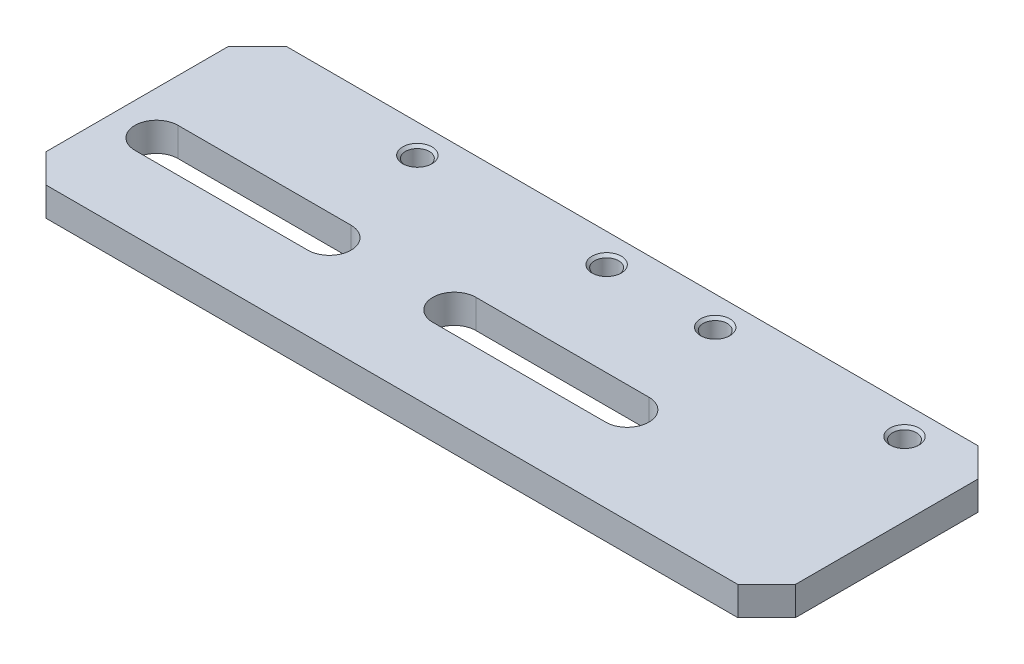
ISO-10303-21;
HEADER;
FILE_DESCRIPTION(('STEP AP214'),'2;1');
FILE_NAME('part.step','',(''),(''),'','','');
FILE_SCHEMA(('AUTOMOTIVE_DESIGN { 1 0 10303 214 1 1 1 1 }'));
ENDSEC;
DATA;
#1=APPLICATION_CONTEXT('core data for automotive mechanical design processes');
#2=APPLICATION_PROTOCOL_DEFINITION('international standard','automotive_design',2000,#1);
#3=PRODUCT_CONTEXT('',#1,'mechanical');
#4=PRODUCT('Part','Part','',(#3));
#5=PRODUCT_RELATED_PRODUCT_CATEGORY('part','',(#4));
#6=PRODUCT_DEFINITION_FORMATION('','',#4);
#7=PRODUCT_DEFINITION_CONTEXT('part definition',#1,'design');
#8=PRODUCT_DEFINITION('design','',#6,#7);
#9=PRODUCT_DEFINITION_SHAPE('','',#8);
#10=(LENGTH_UNIT() NAMED_UNIT(*) SI_UNIT(.MILLI.,.METRE.));
#11=(NAMED_UNIT(*) PLANE_ANGLE_UNIT() SI_UNIT($,.RADIAN.));
#12=(NAMED_UNIT(*) SI_UNIT($,.STERADIAN.) SOLID_ANGLE_UNIT());
#13=UNCERTAINTY_MEASURE_WITH_UNIT(LENGTH_MEASURE(1.E-05),#10,'distance_accuracy_value','');
#14=(GEOMETRIC_REPRESENTATION_CONTEXT(3) GLOBAL_UNCERTAINTY_ASSIGNED_CONTEXT((#13)) GLOBAL_UNIT_ASSIGNED_CONTEXT((#10,
#11,#12)) REPRESENTATION_CONTEXT('',''));
#15=CARTESIAN_POINT('',(0.,0.,0.));
#16=DIRECTION('',(0.,0.,1.));
#17=DIRECTION('',(1.,0.,0.));
#18=AXIS2_PLACEMENT_3D('',#15,#16,#17);
#19=CARTESIAN_POINT('',(30.,3.,-12.5));
#20=DIRECTION('',(-0.707106781186548,0.,0.707106781186547));
#21=DIRECTION('',(0.,1.,0.));
#22=AXIS2_PLACEMENT_3D('',#19,#20,#21);
#23=PLANE('',#22);
#24=DIRECTION('',(-0.707106781186547,0.,-0.707106781186548));
#25=VECTOR('',#24,1.);
#26=CARTESIAN_POINT('',(21.25,3.,-21.25));
#27=LINE('',#26,#25);
#28=CARTESIAN_POINT('',(33.,3.,-9.5));
#29=VERTEX_POINT('',#28);
#30=CARTESIAN_POINT('',(30.,3.,-12.5));
#31=VERTEX_POINT('',#30);
#32=EDGE_CURVE('E345',#29,#31,#27,.T.);
#33=ORIENTED_EDGE('',*,*,#32,.F.);
#34=DIRECTION('',(0.,1.,0.));
#35=VECTOR('',#34,1.);
#36=CARTESIAN_POINT('',(33.,3.,-9.5));
#37=LINE('',#36,#35);
#38=CARTESIAN_POINT('',(33.,0.,-9.5));
#39=VERTEX_POINT('',#38);
#40=EDGE_CURVE('E302',#39,#29,#37,.T.);
#41=ORIENTED_EDGE('',*,*,#40,.F.);
#42=DIRECTION('',(0.707106781186547,0.,0.707106781186548));
#43=VECTOR('',#42,1.);
#44=CARTESIAN_POINT('',(30.,0.,-12.5));
#45=LINE('',#44,#43);
#46=CARTESIAN_POINT('',(30.,0.,-12.5));
#47=VERTEX_POINT('',#46);
#48=EDGE_CURVE('E242',#47,#39,#45,.T.);
#49=ORIENTED_EDGE('',*,*,#48,.F.);
#50=DIRECTION('',(0.,-1.,0.));
#51=VECTOR('',#50,1.);
#52=CARTESIAN_POINT('',(30.,3.,-12.5));
#53=LINE('',#52,#51);
#54=EDGE_CURVE('E334',#31,#47,#53,.T.);
#55=ORIENTED_EDGE('',*,*,#54,.F.);
#56=EDGE_LOOP('',(#33,#41,#49,#55));
#57=FACE_BOUND('',#56,.T.);
#58=ADVANCED_FACE('F17',(#57),#23,.F.);
#59=CARTESIAN_POINT('',(-45.,3.,-9.5));
#60=DIRECTION('',(0.707106781186548,0.,0.707106781186548));
#61=DIRECTION('',(0.,-1.,0.));
#62=AXIS2_PLACEMENT_3D('',#59,#60,#61);
#63=PLANE('',#62);
#64=DIRECTION('',(-0.707106781186548,0.,0.707106781186548));
#65=VECTOR('',#64,1.);
#66=CARTESIAN_POINT('',(-27.25,3.,-27.25));
#67=LINE('',#66,#65);
#68=CARTESIAN_POINT('',(-42.,3.,-12.5));
#69=VERTEX_POINT('',#68);
#70=CARTESIAN_POINT('',(-45.,3.,-9.5));
#71=VERTEX_POINT('',#70);
#72=EDGE_CURVE('E348',#69,#71,#67,.T.);
#73=ORIENTED_EDGE('',*,*,#72,.F.);
#74=DIRECTION('',(0.,1.,0.));
#75=VECTOR('',#74,1.);
#76=CARTESIAN_POINT('',(-42.,3.,-12.5));
#77=LINE('',#76,#75);
#78=CARTESIAN_POINT('',(-42.,0.,-12.5));
#79=VERTEX_POINT('',#78);
#80=EDGE_CURVE('E236',#79,#69,#77,.T.);
#81=ORIENTED_EDGE('',*,*,#80,.F.);
#82=DIRECTION('',(0.707106781186548,0.,-0.707106781186548));
#83=VECTOR('',#82,1.);
#84=CARTESIAN_POINT('',(-45.,0.,-9.5));
#85=LINE('',#84,#83);
#86=CARTESIAN_POINT('',(-45.,0.,-9.5));
#87=VERTEX_POINT('',#86);
#88=EDGE_CURVE('E230',#87,#79,#85,.T.);
#89=ORIENTED_EDGE('',*,*,#88,.F.);
#90=DIRECTION('',(0.,-1.,0.));
#91=VECTOR('',#90,1.);
#92=CARTESIAN_POINT('',(-45.,3.,-9.5));
#93=LINE('',#92,#91);
#94=EDGE_CURVE('E233',#71,#87,#93,.T.);
#95=ORIENTED_EDGE('',*,*,#94,.F.);
#96=EDGE_LOOP('',(#73,#81,#89,#95));
#97=FACE_BOUND('',#96,.T.);
#98=ADVANCED_FACE('F232',(#97),#63,.F.);
#99=CARTESIAN_POINT('',(-42.,3.,12.5));
#100=DIRECTION('',(0.70710678118655,0.,-0.707106781186545));
#101=DIRECTION('',(0.,-1.,0.));
#102=AXIS2_PLACEMENT_3D('',#99,#100,#101);
#103=PLANE('',#102);
#104=DIRECTION('',(0.707106781186545,0.,0.70710678118655));
#105=VECTOR('',#104,1.);
#106=CARTESIAN_POINT('',(-27.25,3.,27.25));
#107=LINE('',#106,#105);
#108=CARTESIAN_POINT('',(-45.,3.,9.5));
#109=VERTEX_POINT('',#108);
#110=CARTESIAN_POINT('',(-42.,3.,12.5));
#111=VERTEX_POINT('',#110);
#112=EDGE_CURVE('E351',#109,#111,#107,.T.);
#113=ORIENTED_EDGE('',*,*,#112,.F.);
#114=DIRECTION('',(0.,1.,0.));
#115=VECTOR('',#114,1.);
#116=CARTESIAN_POINT('',(-45.,3.,9.5));
#117=LINE('',#116,#115);
#118=CARTESIAN_POINT('',(-45.,0.,9.5));
#119=VERTEX_POINT('',#118);
#120=EDGE_CURVE('E260',#119,#109,#117,.T.);
#121=ORIENTED_EDGE('',*,*,#120,.F.);
#122=DIRECTION('',(-0.707106781186545,0.,-0.70710678118655));
#123=VECTOR('',#122,1.);
#124=CARTESIAN_POINT('',(-42.,0.,12.5));
#125=LINE('',#124,#123);
#126=CARTESIAN_POINT('',(-42.,0.,12.5));
#127=VERTEX_POINT('',#126);
#128=EDGE_CURVE('E243',#127,#119,#125,.T.);
#129=ORIENTED_EDGE('',*,*,#128,.F.);
#130=DIRECTION('',(0.,-1.,0.));
#131=VECTOR('',#130,1.);
#132=CARTESIAN_POINT('',(-42.,3.,12.5));
#133=LINE('',#132,#131);
#134=EDGE_CURVE('E272',#111,#127,#133,.T.);
#135=ORIENTED_EDGE('',*,*,#134,.F.);
#136=EDGE_LOOP('',(#113,#121,#129,#135));
#137=FACE_BOUND('',#136,.T.);
#138=ADVANCED_FACE('F790',(#137),#103,.F.);
#139=CARTESIAN_POINT('',(33.,3.,9.5));
#140=DIRECTION('',(-0.707106781186547,0.,-0.707106781186548));
#141=DIRECTION('',(-0.707106781186548,0.,0.707106781186547));
#142=AXIS2_PLACEMENT_3D('',#139,#140,#141);
#143=PLANE('',#142);
#144=DIRECTION('',(0.707106781186548,0.,-0.707106781186547));
#145=VECTOR('',#144,1.);
#146=CARTESIAN_POINT('',(21.25,3.,21.25));
#147=LINE('',#146,#145);
#148=CARTESIAN_POINT('',(30.,3.,12.5));
#149=VERTEX_POINT('',#148);
#150=CARTESIAN_POINT('',(33.,3.,9.5));
#151=VERTEX_POINT('',#150);
#152=EDGE_CURVE('E342',#149,#151,#147,.T.);
#153=ORIENTED_EDGE('',*,*,#152,.F.);
#154=DIRECTION('',(0.,1.,0.));
#155=VECTOR('',#154,1.);
#156=CARTESIAN_POINT('',(30.,3.,12.5));
#157=LINE('',#156,#155);
#158=CARTESIAN_POINT('',(30.,0.,12.5));
#159=VERTEX_POINT('',#158);
#160=EDGE_CURVE('E273',#159,#149,#157,.T.);
#161=ORIENTED_EDGE('',*,*,#160,.F.);
#162=DIRECTION('',(-0.707106781186548,0.,0.707106781186547));
#163=VECTOR('',#162,1.);
#164=CARTESIAN_POINT('',(33.,0.,9.5));
#165=LINE('',#164,#163);
#166=CARTESIAN_POINT('',(33.,0.,9.5));
#167=VERTEX_POINT('',#166);
#168=EDGE_CURVE('E335',#167,#159,#165,.T.);
#169=ORIENTED_EDGE('',*,*,#168,.F.);
#170=DIRECTION('',(0.,-1.,0.));
#171=VECTOR('',#170,1.);
#172=CARTESIAN_POINT('',(33.,3.,9.5));
#173=LINE('',#172,#171);
#174=EDGE_CURVE('E303',#151,#167,#173,.T.);
#175=ORIENTED_EDGE('',*,*,#174,.F.);
#176=EDGE_LOOP('',(#153,#161,#169,#175));
#177=FACE_BOUND('',#176,.T.);
#178=ADVANCED_FACE('F785',(#177),#143,.F.);
#179=CARTESIAN_POINT('',(-25.35,3.,-9.5));
#180=DIRECTION('',(0.,1.,0.));
#181=DIRECTION('',(0.,0.,1.));
#182=AXIS2_PLACEMENT_3D('',#179,#180,#181);
#183=CONICAL_SURFACE('',#182,1.525,0.785398163397445);
#184=CARTESIAN_POINT('',(-25.35,2.725,-9.5));
#185=DIRECTION('',(0.,1.,0.));
#186=DIRECTION('',(0.,0.,1.));
#187=AXIS2_PLACEMENT_3D('',#184,#185,#186);
#188=CIRCLE('',#187,1.24999999999999);
#189=CARTESIAN_POINT('',(-25.35,2.725,-8.25));
#190=VERTEX_POINT('',#189);
#191=EDGE_CURVE('E11',#190,#190,#188,.T.);
#192=ORIENTED_EDGE('',*,*,#191,.F.);
#193=EDGE_LOOP('',(#192));
#194=FACE_BOUND('',#193,.T.);
#195=CARTESIAN_POINT('',(-25.35,3.,-9.5));
#196=DIRECTION('',(0.,1.,0.));
#197=DIRECTION('',(0.,0.,1.));
#198=AXIS2_PLACEMENT_3D('',#195,#196,#197);
#199=CIRCLE('',#198,1.525);
#200=CARTESIAN_POINT('',(-25.35,3.,-7.975));
#201=VERTEX_POINT('',#200);
#202=EDGE_CURVE('E362',#201,#201,#199,.T.);
#203=ORIENTED_EDGE('',*,*,#202,.T.);
#204=EDGE_LOOP('',(#203));
#205=FACE_BOUND('',#204,.T.);
#206=ADVANCED_FACE('F789',(#194,#205),#183,.F.);
#207=CARTESIAN_POINT('',(-25.35,3.,-9.5));
#208=DIRECTION('',(0.,1.,0.));
#209=DIRECTION('',(0.,0.,1.));
#210=AXIS2_PLACEMENT_3D('',#207,#208,#209);
#211=CYLINDRICAL_SURFACE('',#210,1.25);
#212=CARTESIAN_POINT('',(-25.35,0.275,-9.5));
#213=DIRECTION('',(0.,1.,0.));
#214=DIRECTION('',(0.,0.,1.));
#215=AXIS2_PLACEMENT_3D('',#212,#213,#214);
#216=CIRCLE('',#215,1.25);
#217=CARTESIAN_POINT('',(-25.35,0.275,-8.25));
#218=VERTEX_POINT('',#217);
#219=EDGE_CURVE('E25',#218,#218,#216,.T.);
#220=ORIENTED_EDGE('',*,*,#219,.F.);
#221=EDGE_LOOP('',(#220));
#222=FACE_BOUND('',#221,.T.);
#223=ORIENTED_EDGE('',*,*,#191,.T.);
#224=EDGE_LOOP('',(#223));
#225=FACE_BOUND('',#224,.T.);
#226=ADVANCED_FACE('F1003',(#222,#225),#211,.F.);
#227=CARTESIAN_POINT('',(-25.35,0.275,-9.5));
#228=DIRECTION('',(0.,-1.,0.));
#229=DIRECTION('',(0.,0.,-1.));
#230=AXIS2_PLACEMENT_3D('',#227,#228,#229);
#231=CONICAL_SURFACE('',#230,1.25,0.78539816339745);
#232=ORIENTED_EDGE('',*,*,#219,.T.);
#233=EDGE_LOOP('',(#232));
#234=FACE_BOUND('',#233,.T.);
#235=CARTESIAN_POINT('',(-25.35,0.,-9.5));
#236=DIRECTION('',(0.,1.,0.));
#237=DIRECTION('',(0.,0.,1.));
#238=AXIS2_PLACEMENT_3D('',#235,#236,#237);
#239=CIRCLE('',#238,1.525);
#240=CARTESIAN_POINT('',(-25.35,0.,-7.975));
#241=VERTEX_POINT('',#240);
#242=EDGE_CURVE('E424',#241,#241,#239,.T.);
#243=ORIENTED_EDGE('',*,*,#242,.F.);
#244=EDGE_LOOP('',(#243));
#245=FACE_BOUND('',#244,.T.);
#246=ADVANCED_FACE('F994',(#234,#245),#231,.F.);
#247=CARTESIAN_POINT('',(-5.65,3.,-9.5));
#248=DIRECTION('',(0.,1.,0.));
#249=DIRECTION('',(0.,0.,1.));
#250=AXIS2_PLACEMENT_3D('',#247,#248,#249);
#251=CONICAL_SURFACE('',#250,1.525,0.785398163397448);
#252=CARTESIAN_POINT('',(-5.65,2.725,-9.5));
#253=DIRECTION('',(0.,1.,0.));
#254=DIRECTION('',(0.,0.,1.));
#255=AXIS2_PLACEMENT_3D('',#252,#253,#254);
#256=CIRCLE('',#255,1.24999999999999);
#257=CARTESIAN_POINT('',(-5.65,2.725,-8.25));
#258=VERTEX_POINT('',#257);
#259=EDGE_CURVE('E304',#258,#258,#256,.T.);
#260=ORIENTED_EDGE('',*,*,#259,.F.);
#261=EDGE_LOOP('',(#260));
#262=FACE_BOUND('',#261,.T.);
#263=CARTESIAN_POINT('',(-5.65,3.,-9.5));
#264=DIRECTION('',(0.,1.,0.));
#265=DIRECTION('',(0.,0.,1.));
#266=AXIS2_PLACEMENT_3D('',#263,#264,#265);
#267=CIRCLE('',#266,1.525);
#268=CARTESIAN_POINT('',(-5.65,3.,-7.975));
#269=VERTEX_POINT('',#268);
#270=EDGE_CURVE('E365',#269,#269,#267,.T.);
#271=ORIENTED_EDGE('',*,*,#270,.T.);
#272=EDGE_LOOP('',(#271));
#273=FACE_BOUND('',#272,.T.);
#274=ADVANCED_FACE('F925',(#262,#273),#251,.F.);
#275=CARTESIAN_POINT('',(-5.65,3.,-9.5));
#276=DIRECTION('',(0.,1.,0.));
#277=DIRECTION('',(0.,0.,1.));
#278=AXIS2_PLACEMENT_3D('',#275,#276,#277);
#279=CYLINDRICAL_SURFACE('',#278,1.25);
#280=CARTESIAN_POINT('',(-5.65,0.275,-9.5));
#281=DIRECTION('',(0.,1.,0.));
#282=DIRECTION('',(0.,0.,1.));
#283=AXIS2_PLACEMENT_3D('',#280,#281,#282);
#284=CIRCLE('',#283,1.25);
#285=CARTESIAN_POINT('',(-5.65,0.275,-8.25));
#286=VERTEX_POINT('',#285);
#287=EDGE_CURVE('E307',#286,#286,#284,.T.);
#288=ORIENTED_EDGE('',*,*,#287,.F.);
#289=EDGE_LOOP('',(#288));
#290=FACE_BOUND('',#289,.T.);
#291=ORIENTED_EDGE('',*,*,#259,.T.);
#292=EDGE_LOOP('',(#291));
#293=FACE_BOUND('',#292,.T.);
#294=ADVANCED_FACE('F920',(#290,#293),#279,.F.);
#295=CARTESIAN_POINT('',(-5.65,0.275,-9.5));
#296=DIRECTION('',(0.,-1.,0.));
#297=DIRECTION('',(0.,0.,-1.));
#298=AXIS2_PLACEMENT_3D('',#295,#296,#297);
#299=CONICAL_SURFACE('',#298,1.25,0.785398163397447);
#300=ORIENTED_EDGE('',*,*,#287,.T.);
#301=EDGE_LOOP('',(#300));
#302=FACE_BOUND('',#301,.T.);
#303=CARTESIAN_POINT('',(-5.65,0.,-9.5));
#304=DIRECTION('',(0.,1.,0.));
#305=DIRECTION('',(0.,0.,1.));
#306=AXIS2_PLACEMENT_3D('',#303,#304,#305);
#307=CIRCLE('',#306,1.525);
#308=CARTESIAN_POINT('',(-5.65,0.,-7.975));
#309=VERTEX_POINT('',#308);
#310=EDGE_CURVE('E427',#309,#309,#307,.T.);
#311=ORIENTED_EDGE('',*,*,#310,.F.);
#312=EDGE_LOOP('',(#311));
#313=FACE_BOUND('',#312,.T.);
#314=ADVANCED_FACE('F924',(#302,#313),#299,.F.);
#315=CARTESIAN_POINT('',(25.35,3.,-9.5));
#316=DIRECTION('',(0.,1.,0.));
#317=DIRECTION('',(0.,0.,1.));
#318=AXIS2_PLACEMENT_3D('',#315,#316,#317);
#319=CONICAL_SURFACE('',#318,1.525,0.785398163397445);
#320=CARTESIAN_POINT('',(25.35,2.725,-9.5));
#321=DIRECTION('',(0.,1.,0.));
#322=DIRECTION('',(0.,0.,1.));
#323=AXIS2_PLACEMENT_3D('',#320,#321,#322);
#324=CIRCLE('',#323,1.24999999999999);
#325=CARTESIAN_POINT('',(25.35,2.725,-8.25));
#326=VERTEX_POINT('',#325);
#327=EDGE_CURVE('E458',#326,#326,#324,.T.);
#328=ORIENTED_EDGE('',*,*,#327,.F.);
#329=EDGE_LOOP('',(#328));
#330=FACE_BOUND('',#329,.T.);
#331=CARTESIAN_POINT('',(25.35,3.,-9.5));
#332=DIRECTION('',(0.,1.,0.));
#333=DIRECTION('',(0.,0.,1.));
#334=AXIS2_PLACEMENT_3D('',#331,#332,#333);
#335=CIRCLE('',#334,1.525);
#336=CARTESIAN_POINT('',(25.35,3.,-7.975));
#337=VERTEX_POINT('',#336);
#338=EDGE_CURVE('E368',#337,#337,#335,.T.);
#339=ORIENTED_EDGE('',*,*,#338,.T.);
#340=EDGE_LOOP('',(#339));
#341=FACE_BOUND('',#340,.T.);
#342=ADVANCED_FACE('F969',(#330,#341),#319,.F.);
#343=CARTESIAN_POINT('',(25.35,3.,-9.5));
#344=DIRECTION('',(0.,1.,0.));
#345=DIRECTION('',(0.,0.,1.));
#346=AXIS2_PLACEMENT_3D('',#343,#344,#345);
#347=CYLINDRICAL_SURFACE('',#346,1.25);
#348=CARTESIAN_POINT('',(25.35,0.275,-9.5));
#349=DIRECTION('',(0.,1.,0.));
#350=DIRECTION('',(0.,0.,1.));
#351=AXIS2_PLACEMENT_3D('',#348,#349,#350);
#352=CIRCLE('',#351,1.25);
#353=CARTESIAN_POINT('',(25.35,0.275,-8.25));
#354=VERTEX_POINT('',#353);
#355=EDGE_CURVE('E277',#354,#354,#352,.T.);
#356=ORIENTED_EDGE('',*,*,#355,.F.);
#357=EDGE_LOOP('',(#356));
#358=FACE_BOUND('',#357,.T.);
#359=ORIENTED_EDGE('',*,*,#327,.T.);
#360=EDGE_LOOP('',(#359));
#361=FACE_BOUND('',#360,.T.);
#362=ADVANCED_FACE('F960',(#358,#361),#347,.F.);
#363=CARTESIAN_POINT('',(25.35,0.275,-9.5));
#364=DIRECTION('',(0.,-1.,0.));
#365=DIRECTION('',(0.,0.,-1.));
#366=AXIS2_PLACEMENT_3D('',#363,#364,#365);
#367=CONICAL_SURFACE('',#366,1.25,0.78539816339745);
#368=ORIENTED_EDGE('',*,*,#355,.T.);
#369=EDGE_LOOP('',(#368));
#370=FACE_BOUND('',#369,.T.);
#371=CARTESIAN_POINT('',(25.35,0.,-9.5));
#372=DIRECTION('',(0.,1.,0.));
#373=DIRECTION('',(0.,0.,1.));
#374=AXIS2_PLACEMENT_3D('',#371,#372,#373);
#375=CIRCLE('',#374,1.525);
#376=CARTESIAN_POINT('',(25.35,0.,-7.975));
#377=VERTEX_POINT('',#376);
#378=EDGE_CURVE('E430',#377,#377,#375,.T.);
#379=ORIENTED_EDGE('',*,*,#378,.F.);
#380=EDGE_LOOP('',(#379));
#381=FACE_BOUND('',#380,.T.);
#382=ADVANCED_FACE('F951',(#370,#381),#367,.F.);
#383=CARTESIAN_POINT('',(5.65,3.,-9.5));
#384=DIRECTION('',(0.,1.,0.));
#385=DIRECTION('',(0.,0.,1.));
#386=AXIS2_PLACEMENT_3D('',#383,#384,#385);
#387=CONICAL_SURFACE('',#386,1.525,0.785398163397448);
#388=CARTESIAN_POINT('',(5.65,2.725,-9.5));
#389=DIRECTION('',(0.,1.,0.));
#390=DIRECTION('',(0.,0.,1.));
#391=AXIS2_PLACEMENT_3D('',#388,#389,#390);
#392=CIRCLE('',#391,1.24999999999999);
#393=CARTESIAN_POINT('',(5.65,2.725,-8.25));
#394=VERTEX_POINT('',#393);
#395=EDGE_CURVE('E274',#394,#394,#392,.T.);
#396=ORIENTED_EDGE('',*,*,#395,.F.);
#397=EDGE_LOOP('',(#396));
#398=FACE_BOUND('',#397,.T.);
#399=CARTESIAN_POINT('',(5.65,3.,-9.5));
#400=DIRECTION('',(0.,1.,0.));
#401=DIRECTION('',(0.,0.,1.));
#402=AXIS2_PLACEMENT_3D('',#399,#400,#401);
#403=CIRCLE('',#402,1.525);
#404=CARTESIAN_POINT('',(5.65,3.,-7.975));
#405=VERTEX_POINT('',#404);
#406=EDGE_CURVE('E382',#405,#405,#403,.T.);
#407=ORIENTED_EDGE('',*,*,#406,.T.);
#408=EDGE_LOOP('',(#407));
#409=FACE_BOUND('',#408,.T.);
#410=ADVANCED_FACE('F942',(#398,#409),#387,.F.);
#411=CARTESIAN_POINT('',(5.65,3.,-9.5));
#412=DIRECTION('',(0.,1.,0.));
#413=DIRECTION('',(0.,0.,1.));
#414=AXIS2_PLACEMENT_3D('',#411,#412,#413);
#415=CYLINDRICAL_SURFACE('',#414,1.25);
#416=CARTESIAN_POINT('',(5.65,0.275,-9.5));
#417=DIRECTION('',(0.,1.,0.));
#418=DIRECTION('',(0.,0.,1.));
#419=AXIS2_PLACEMENT_3D('',#416,#417,#418);
#420=CIRCLE('',#419,1.25);
#421=CARTESIAN_POINT('',(5.65,0.275,-8.25));
#422=VERTEX_POINT('',#421);
#423=EDGE_CURVE('E278',#422,#422,#420,.T.);
#424=ORIENTED_EDGE('',*,*,#423,.F.);
#425=EDGE_LOOP('',(#424));
#426=FACE_BOUND('',#425,.T.);
#427=ORIENTED_EDGE('',*,*,#395,.T.);
#428=EDGE_LOOP('',(#427));
#429=FACE_BOUND('',#428,.T.);
#430=ADVANCED_FACE('F856',(#426,#429),#415,.F.);
#431=CARTESIAN_POINT('',(5.65,0.275,-9.5));
#432=DIRECTION('',(0.,-1.,0.));
#433=DIRECTION('',(0.,0.,-1.));
#434=AXIS2_PLACEMENT_3D('',#431,#432,#433);
#435=CONICAL_SURFACE('',#434,1.25,0.785398163397447);
#436=ORIENTED_EDGE('',*,*,#423,.T.);
#437=EDGE_LOOP('',(#436));
#438=FACE_BOUND('',#437,.T.);
#439=CARTESIAN_POINT('',(5.65,0.,-9.5));
#440=DIRECTION('',(0.,1.,0.));
#441=DIRECTION('',(0.,0.,1.));
#442=AXIS2_PLACEMENT_3D('',#439,#440,#441);
#443=CIRCLE('',#442,1.525);
#444=CARTESIAN_POINT('',(5.65,0.,-7.975));
#445=VERTEX_POINT('',#444);
#446=EDGE_CURVE('E413',#445,#445,#443,.T.);
#447=ORIENTED_EDGE('',*,*,#446,.F.);
#448=EDGE_LOOP('',(#447));
#449=FACE_BOUND('',#448,.T.);
#450=ADVANCED_FACE('F852',(#438,#449),#435,.F.);
#451=CARTESIAN_POINT('',(-40.5,0.,4.75));
#452=DIRECTION('',(0.,0.,1.));
#453=DIRECTION('',(1.,0.,0.));
#454=AXIS2_PLACEMENT_3D('',#451,#452,#453);
#455=PLANE('',#454);
#456=DIRECTION('',(1.,0.,0.));
#457=VECTOR('',#456,1.);
#458=CARTESIAN_POINT('',(-40.5,3.,4.75));
#459=LINE('',#458,#457);
#460=CARTESIAN_POINT('',(-40.5,3.,4.75));
#461=VERTEX_POINT('',#460);
#462=CARTESIAN_POINT('',(-22.5,3.,4.75));
#463=VERTEX_POINT('',#462);
#464=EDGE_CURVE('E374',#461,#463,#459,.T.);
#465=ORIENTED_EDGE('',*,*,#464,.T.);
#466=DIRECTION('',(0.,1.,0.));
#467=VECTOR('',#466,1.);
#468=CARTESIAN_POINT('',(-22.5,0.,4.75));
#469=LINE('',#468,#467);
#470=CARTESIAN_POINT('',(-22.5,0.,4.75));
#471=VERTEX_POINT('',#470);
#472=EDGE_CURVE('E294',#471,#463,#469,.T.);
#473=ORIENTED_EDGE('',*,*,#472,.F.);
#474=DIRECTION('',(1.,0.,0.));
#475=VECTOR('',#474,1.);
#476=CARTESIAN_POINT('',(-40.5,0.,4.75));
#477=LINE('',#476,#475);
#478=CARTESIAN_POINT('',(-40.5,0.,4.75));
#479=VERTEX_POINT('',#478);
#480=EDGE_CURVE('E282',#479,#471,#477,.T.);
#481=ORIENTED_EDGE('',*,*,#480,.F.);
#482=DIRECTION('',(0.,1.,0.));
#483=VECTOR('',#482,1.);
#484=CARTESIAN_POINT('',(-40.5,0.,4.75));
#485=LINE('',#484,#483);
#486=EDGE_CURVE('E451',#479,#461,#485,.T.);
#487=ORIENTED_EDGE('',*,*,#486,.T.);
#488=EDGE_LOOP('',(#465,#473,#481,#487));
#489=FACE_BOUND('',#488,.T.);
#490=ADVANCED_FACE('F829',(#489),#455,.F.);
#491=CARTESIAN_POINT('',(-22.5,0.,2.5));
#492=DIRECTION('',(0.,1.,0.));
#493=DIRECTION('',(0.,0.,1.));
#494=AXIS2_PLACEMENT_3D('',#491,#492,#493);
#495=CYLINDRICAL_SURFACE('',#494,2.25);
#496=CARTESIAN_POINT('',(-22.5,3.,2.5));
#497=DIRECTION('',(0.,1.,0.));
#498=DIRECTION('',(0.,0.,1.));
#499=AXIS2_PLACEMENT_3D('',#496,#497,#498);
#500=CIRCLE('',#499,2.25);
#501=CARTESIAN_POINT('',(-22.5,3.,0.250000000000004));
#502=VERTEX_POINT('',#501);
#503=EDGE_CURVE('E379',#463,#502,#500,.T.);
#504=ORIENTED_EDGE('',*,*,#503,.T.);
#505=DIRECTION('',(0.,1.,0.));
#506=VECTOR('',#505,1.);
#507=CARTESIAN_POINT('',(-22.5,0.,0.250000000000004));
#508=LINE('',#507,#506);
#509=CARTESIAN_POINT('',(-22.5,0.,0.250000000000004));
#510=VERTEX_POINT('',#509);
#511=EDGE_CURVE('E297',#510,#502,#508,.T.);
#512=ORIENTED_EDGE('',*,*,#511,.F.);
#513=CARTESIAN_POINT('',(-22.5,0.,2.5));
#514=DIRECTION('',(0.,1.,0.));
#515=DIRECTION('',(0.,0.,1.));
#516=AXIS2_PLACEMENT_3D('',#513,#514,#515);
#517=CIRCLE('',#516,2.25);
#518=EDGE_CURVE('E359',#471,#510,#517,.T.);
#519=ORIENTED_EDGE('',*,*,#518,.F.);
#520=ORIENTED_EDGE('',*,*,#472,.T.);
#521=EDGE_LOOP('',(#504,#512,#519,#520));
#522=FACE_BOUND('',#521,.T.);
#523=ADVANCED_FACE('F824',(#522),#495,.F.);
#524=CARTESIAN_POINT('',(-40.5,0.,0.250000000000004));
#525=DIRECTION('',(0.,0.,-1.));
#526=DIRECTION('',(0.,-1.,0.));
#527=AXIS2_PLACEMENT_3D('',#524,#525,#526);
#528=PLANE('',#527);
#529=DIRECTION('',(-1.,0.,0.));
#530=VECTOR('',#529,1.);
#531=CARTESIAN_POINT('',(-40.5,3.,0.250000000000004));
#532=LINE('',#531,#530);
#533=CARTESIAN_POINT('',(-40.5,3.,0.250000000000004));
#534=VERTEX_POINT('',#533);
#535=EDGE_CURVE('E389',#502,#534,#532,.T.);
#536=ORIENTED_EDGE('',*,*,#535,.T.);
#537=DIRECTION('',(0.,1.,0.));
#538=VECTOR('',#537,1.);
#539=CARTESIAN_POINT('',(-40.5,0.,0.250000000000004));
#540=LINE('',#539,#538);
#541=CARTESIAN_POINT('',(-40.5,0.,0.250000000000004));
#542=VERTEX_POINT('',#541);
#543=EDGE_CURVE('E398',#542,#534,#540,.T.);
#544=ORIENTED_EDGE('',*,*,#543,.F.);
#545=DIRECTION('',(-1.,0.,0.));
#546=VECTOR('',#545,1.);
#547=CARTESIAN_POINT('',(-40.5,0.,0.250000000000004));
#548=LINE('',#547,#546);
#549=EDGE_CURVE('E283',#510,#542,#548,.T.);
#550=ORIENTED_EDGE('',*,*,#549,.F.);
#551=ORIENTED_EDGE('',*,*,#511,.T.);
#552=EDGE_LOOP('',(#536,#544,#550,#551));
#553=FACE_BOUND('',#552,.T.);
#554=ADVANCED_FACE('F828',(#553),#528,.F.);
#555=CARTESIAN_POINT('',(-40.5,0.,2.5));
#556=DIRECTION('',(0.,1.,0.));
#557=DIRECTION('',(0.,0.,1.));
#558=AXIS2_PLACEMENT_3D('',#555,#556,#557);
#559=CYLINDRICAL_SURFACE('',#558,2.25);
#560=CARTESIAN_POINT('',(-40.5,3.,2.5));
#561=DIRECTION('',(0.,1.,0.));
#562=DIRECTION('',(0.,0.,1.));
#563=AXIS2_PLACEMENT_3D('',#560,#561,#562);
#564=CIRCLE('',#563,2.25);
#565=EDGE_CURVE('E385',#534,#461,#564,.T.);
#566=ORIENTED_EDGE('',*,*,#565,.T.);
#567=ORIENTED_EDGE('',*,*,#486,.F.);
#568=CARTESIAN_POINT('',(-40.5,0.,2.5));
#569=DIRECTION('',(0.,1.,0.));
#570=DIRECTION('',(0.,0.,1.));
#571=AXIS2_PLACEMENT_3D('',#568,#569,#570);
#572=CIRCLE('',#571,2.25);
#573=EDGE_CURVE('E279',#542,#479,#572,.T.);
#574=ORIENTED_EDGE('',*,*,#573,.F.);
#575=ORIENTED_EDGE('',*,*,#543,.T.);
#576=EDGE_LOOP('',(#566,#567,#574,#575));
#577=FACE_BOUND('',#576,.T.);
#578=ADVANCED_FACE('F898',(#577),#559,.F.);
#579=CARTESIAN_POINT('',(8.5,0.,0.249999999999989));
#580=DIRECTION('',(0.,0.,-1.));
#581=DIRECTION('',(-1.,0.,0.));
#582=AXIS2_PLACEMENT_3D('',#579,#580,#581);
#583=PLANE('',#582);
#584=DIRECTION('',(-1.,0.,0.));
#585=VECTOR('',#584,1.);
#586=CARTESIAN_POINT('',(8.5,3.,0.249999999999989));
#587=LINE('',#586,#585);
#588=CARTESIAN_POINT('',(8.5,3.,0.249999999999989));
#589=VERTEX_POINT('',#588);
#590=CARTESIAN_POINT('',(-9.5,3.,0.249999999999996));
#591=VERTEX_POINT('',#590);
#592=EDGE_CURVE('E338',#589,#591,#587,.T.);
#593=ORIENTED_EDGE('',*,*,#592,.T.);
#594=DIRECTION('',(0.,1.,0.));
#595=VECTOR('',#594,1.);
#596=CARTESIAN_POINT('',(-9.5,0.,0.249999999999996));
#597=LINE('',#596,#595);
#598=CARTESIAN_POINT('',(-9.5,0.,0.249999999999995));
#599=VERTEX_POINT('',#598);
#600=EDGE_CURVE('E448',#599,#591,#597,.T.);
#601=ORIENTED_EDGE('',*,*,#600,.F.);
#602=DIRECTION('',(-1.,0.,0.));
#603=VECTOR('',#602,1.);
#604=CARTESIAN_POINT('',(8.5,0.,0.249999999999989));
#605=LINE('',#604,#603);
#606=CARTESIAN_POINT('',(8.5,0.,0.249999999999989));
#607=VERTEX_POINT('',#606);
#608=EDGE_CURVE('E369',#607,#599,#605,.T.);
#609=ORIENTED_EDGE('',*,*,#608,.F.);
#610=DIRECTION('',(0.,1.,0.));
#611=VECTOR('',#610,1.);
#612=CARTESIAN_POINT('',(8.5,0.,0.249999999999989));
#613=LINE('',#612,#611);
#614=EDGE_CURVE('E328',#607,#589,#613,.T.);
#615=ORIENTED_EDGE('',*,*,#614,.T.);
#616=EDGE_LOOP('',(#593,#601,#609,#615));
#617=FACE_BOUND('',#616,.T.);
#618=ADVANCED_FACE('F808',(#617),#583,.F.);
#619=CARTESIAN_POINT('',(-9.5,0.,2.5));
#620=DIRECTION('',(0.,1.,0.));
#621=DIRECTION('',(0.,0.,1.));
#622=AXIS2_PLACEMENT_3D('',#619,#620,#621);
#623=CYLINDRICAL_SURFACE('',#622,2.25);
#624=CARTESIAN_POINT('',(-9.5,3.,2.5));
#625=DIRECTION('',(0.,1.,0.));
#626=DIRECTION('',(0.,0.,1.));
#627=AXIS2_PLACEMENT_3D('',#624,#625,#626);
#628=CIRCLE('',#627,2.25);
#629=CARTESIAN_POINT('',(-9.5,3.,4.75));
#630=VERTEX_POINT('',#629);
#631=EDGE_CURVE('E409',#591,#630,#628,.T.);
#632=ORIENTED_EDGE('',*,*,#631,.T.);
#633=DIRECTION('',(0.,1.,0.));
#634=VECTOR('',#633,1.);
#635=CARTESIAN_POINT('',(-9.5,0.,4.75));
#636=LINE('',#635,#634);
#637=CARTESIAN_POINT('',(-9.5,0.,4.75));
#638=VERTEX_POINT('',#637);
#639=EDGE_CURVE('E327',#638,#630,#636,.T.);
#640=ORIENTED_EDGE('',*,*,#639,.F.);
#641=CARTESIAN_POINT('',(-9.5,0.,2.5));
#642=DIRECTION('',(0.,1.,0.));
#643=DIRECTION('',(0.,0.,1.));
#644=AXIS2_PLACEMENT_3D('',#641,#642,#643);
#645=CIRCLE('',#644,2.25);
#646=EDGE_CURVE('E373',#599,#638,#645,.T.);
#647=ORIENTED_EDGE('',*,*,#646,.F.);
#648=ORIENTED_EDGE('',*,*,#600,.T.);
#649=EDGE_LOOP('',(#632,#640,#647,#648));
#650=FACE_BOUND('',#649,.T.);
#651=ADVANCED_FACE('F803',(#650),#623,.F.);
#652=CARTESIAN_POINT('',(8.5,0.,4.75));
#653=DIRECTION('',(0.,0.,1.));
#654=DIRECTION('',(1.,0.,0.));
#655=AXIS2_PLACEMENT_3D('',#652,#653,#654);
#656=PLANE('',#655);
#657=DIRECTION('',(1.,0.,0.));
#658=VECTOR('',#657,1.);
#659=CARTESIAN_POINT('',(8.5,3.,4.75));
#660=LINE('',#659,#658);
#661=CARTESIAN_POINT('',(8.5,3.,4.75));
#662=VERTEX_POINT('',#661);
#663=EDGE_CURVE('E402',#630,#662,#660,.T.);
#664=ORIENTED_EDGE('',*,*,#663,.T.);
#665=DIRECTION('',(0.,1.,0.));
#666=VECTOR('',#665,1.);
#667=CARTESIAN_POINT('',(8.5,0.,4.75));
#668=LINE('',#667,#666);
#669=CARTESIAN_POINT('',(8.5,0.,4.75));
#670=VERTEX_POINT('',#669);
#671=EDGE_CURVE('E324',#670,#662,#668,.T.);
#672=ORIENTED_EDGE('',*,*,#671,.F.);
#673=DIRECTION('',(1.,0.,0.));
#674=VECTOR('',#673,1.);
#675=CARTESIAN_POINT('',(8.5,0.,4.75));
#676=LINE('',#675,#674);
#677=EDGE_CURVE('E354',#638,#670,#676,.T.);
#678=ORIENTED_EDGE('',*,*,#677,.F.);
#679=ORIENTED_EDGE('',*,*,#639,.T.);
#680=EDGE_LOOP('',(#664,#672,#678,#679));
#681=FACE_BOUND('',#680,.T.);
#682=ADVANCED_FACE('F807',(#681),#656,.F.);
#683=CARTESIAN_POINT('',(8.5,0.,2.5));
#684=DIRECTION('',(0.,1.,0.));
#685=DIRECTION('',(0.,0.,1.));
#686=AXIS2_PLACEMENT_3D('',#683,#684,#685);
#687=CYLINDRICAL_SURFACE('',#686,2.25);
#688=CARTESIAN_POINT('',(8.5,3.,2.5));
#689=DIRECTION('',(0.,1.,0.));
#690=DIRECTION('',(0.,0.,1.));
#691=AXIS2_PLACEMENT_3D('',#688,#689,#690);
#692=CIRCLE('',#691,2.25);
#693=EDGE_CURVE('E378',#662,#589,#692,.T.);
#694=ORIENTED_EDGE('',*,*,#693,.T.);
#695=ORIENTED_EDGE('',*,*,#614,.F.);
#696=CARTESIAN_POINT('',(8.5,0.,2.5));
#697=DIRECTION('',(0.,1.,0.));
#698=DIRECTION('',(0.,0.,1.));
#699=AXIS2_PLACEMENT_3D('',#696,#697,#698);
#700=CIRCLE('',#699,2.25);
#701=EDGE_CURVE('E358',#670,#607,#700,.T.);
#702=ORIENTED_EDGE('',*,*,#701,.F.);
#703=ORIENTED_EDGE('',*,*,#671,.T.);
#704=EDGE_LOOP('',(#694,#695,#702,#703));
#705=FACE_BOUND('',#704,.T.);
#706=ADVANCED_FACE('F835',(#705),#687,.F.);
#707=CARTESIAN_POINT('',(0.,0.,0.));
#708=DIRECTION('',(0.,1.,0.));
#709=DIRECTION('',(1.,0.,0.));
#710=AXIS2_PLACEMENT_3D('',#707,#708,#709);
#711=PLANE('',#710);
#712=ORIENTED_EDGE('',*,*,#677,.T.);
#713=ORIENTED_EDGE('',*,*,#701,.T.);
#714=ORIENTED_EDGE('',*,*,#608,.T.);
#715=ORIENTED_EDGE('',*,*,#646,.T.);
#716=EDGE_LOOP('',(#712,#713,#714,#715));
#717=FACE_BOUND('',#716,.T.);
#718=ORIENTED_EDGE('',*,*,#549,.T.);
#719=ORIENTED_EDGE('',*,*,#573,.T.);
#720=ORIENTED_EDGE('',*,*,#480,.T.);
#721=ORIENTED_EDGE('',*,*,#518,.T.);
#722=EDGE_LOOP('',(#718,#719,#720,#721));
#723=FACE_BOUND('',#722,.T.);
#724=ORIENTED_EDGE('',*,*,#446,.T.);
#725=EDGE_LOOP('',(#724));
#726=FACE_BOUND('',#725,.T.);
#727=ORIENTED_EDGE('',*,*,#378,.T.);
#728=EDGE_LOOP('',(#727));
#729=FACE_BOUND('',#728,.T.);
#730=ORIENTED_EDGE('',*,*,#310,.T.);
#731=EDGE_LOOP('',(#730));
#732=FACE_BOUND('',#731,.T.);
#733=ORIENTED_EDGE('',*,*,#242,.T.);
#734=EDGE_LOOP('',(#733));
#735=FACE_BOUND('',#734,.T.);
#736=DIRECTION('',(0.,0.,-1.));
#737=VECTOR('',#736,1.);
#738=CARTESIAN_POINT('',(33.,0.,12.5));
#739=LINE('',#738,#737);
#740=EDGE_CURVE('E298',#167,#39,#739,.T.);
#741=ORIENTED_EDGE('',*,*,#740,.F.);
#742=ORIENTED_EDGE('',*,*,#168,.T.);
#743=DIRECTION('',(1.,0.,0.));
#744=VECTOR('',#743,1.);
#745=CARTESIAN_POINT('',(45.,0.,12.5));
#746=LINE('',#745,#744);
#747=EDGE_CURVE('E253',#127,#159,#746,.T.);
#748=ORIENTED_EDGE('',*,*,#747,.F.);
#749=ORIENTED_EDGE('',*,*,#128,.T.);
#750=DIRECTION('',(0.,0.,1.));
#751=VECTOR('',#750,1.);
#752=CARTESIAN_POINT('',(-45.,0.,12.5));
#753=LINE('',#752,#751);
#754=EDGE_CURVE('E249',#87,#119,#753,.T.);
#755=ORIENTED_EDGE('',*,*,#754,.F.);
#756=ORIENTED_EDGE('',*,*,#88,.T.);
#757=DIRECTION('',(-1.,0.,0.));
#758=VECTOR('',#757,1.);
#759=CARTESIAN_POINT('',(45.,0.,-12.5));
#760=LINE('',#759,#758);
#761=EDGE_CURVE('E293',#47,#79,#760,.T.);
#762=ORIENTED_EDGE('',*,*,#761,.F.);
#763=ORIENTED_EDGE('',*,*,#48,.T.);
#764=EDGE_LOOP('',(#741,#742,#748,#749,#755,#756,#762,#763));
#765=FACE_BOUND('',#764,.T.);
#766=ADVANCED_FACE('F256',(#717,#723,#726,#729,#732,#735,#765),#711,.F.);
#767=CARTESIAN_POINT('',(0.,3.,0.));
#768=DIRECTION('',(0.,1.,0.));
#769=DIRECTION('',(1.,0.,0.));
#770=AXIS2_PLACEMENT_3D('',#767,#768,#769);
#771=PLANE('',#770);
#772=ORIENTED_EDGE('',*,*,#693,.F.);
#773=ORIENTED_EDGE('',*,*,#663,.F.);
#774=ORIENTED_EDGE('',*,*,#631,.F.);
#775=ORIENTED_EDGE('',*,*,#592,.F.);
#776=EDGE_LOOP('',(#772,#773,#774,#775));
#777=FACE_BOUND('',#776,.T.);
#778=ORIENTED_EDGE('',*,*,#565,.F.);
#779=ORIENTED_EDGE('',*,*,#535,.F.);
#780=ORIENTED_EDGE('',*,*,#503,.F.);
#781=ORIENTED_EDGE('',*,*,#464,.F.);
#782=EDGE_LOOP('',(#778,#779,#780,#781));
#783=FACE_BOUND('',#782,.T.);
#784=ORIENTED_EDGE('',*,*,#406,.F.);
#785=EDGE_LOOP('',(#784));
#786=FACE_BOUND('',#785,.T.);
#787=ORIENTED_EDGE('',*,*,#338,.F.);
#788=EDGE_LOOP('',(#787));
#789=FACE_BOUND('',#788,.T.);
#790=ORIENTED_EDGE('',*,*,#270,.F.);
#791=EDGE_LOOP('',(#790));
#792=FACE_BOUND('',#791,.T.);
#793=ORIENTED_EDGE('',*,*,#202,.F.);
#794=EDGE_LOOP('',(#793));
#795=FACE_BOUND('',#794,.T.);
#796=DIRECTION('',(1.,0.,0.));
#797=VECTOR('',#796,1.);
#798=CARTESIAN_POINT('',(45.,3.,12.5));
#799=LINE('',#798,#797);
#800=EDGE_CURVE('E268',#111,#149,#799,.T.);
#801=ORIENTED_EDGE('',*,*,#800,.T.);
#802=ORIENTED_EDGE('',*,*,#152,.T.);
#803=DIRECTION('',(0.,0.,-1.));
#804=VECTOR('',#803,1.);
#805=CARTESIAN_POINT('',(33.,3.,12.5));
#806=LINE('',#805,#804);
#807=EDGE_CURVE('E311',#151,#29,#806,.T.);
#808=ORIENTED_EDGE('',*,*,#807,.T.);
#809=ORIENTED_EDGE('',*,*,#32,.T.);
#810=DIRECTION('',(-1.,0.,0.));
#811=VECTOR('',#810,1.);
#812=CARTESIAN_POINT('',(45.,3.,-12.5));
#813=LINE('',#812,#811);
#814=EDGE_CURVE('E292',#31,#69,#813,.T.);
#815=ORIENTED_EDGE('',*,*,#814,.T.);
#816=ORIENTED_EDGE('',*,*,#72,.T.);
#817=DIRECTION('',(0.,0.,1.));
#818=VECTOR('',#817,1.);
#819=CARTESIAN_POINT('',(-45.,3.,12.5));
#820=LINE('',#819,#818);
#821=EDGE_CURVE('E251',#71,#109,#820,.T.);
#822=ORIENTED_EDGE('',*,*,#821,.T.);
#823=ORIENTED_EDGE('',*,*,#112,.T.);
#824=EDGE_LOOP('',(#801,#802,#808,#809,#815,#816,#822,#823));
#825=FACE_BOUND('',#824,.T.);
#826=ADVANCED_FACE('F865',(#777,#783,#786,#789,#792,#795,#825),#771,.T.);
#827=CARTESIAN_POINT('',(45.,3.,-12.5));
#828=DIRECTION('',(0.,0.,1.));
#829=DIRECTION('',(1.,0.,0.));
#830=AXIS2_PLACEMENT_3D('',#827,#828,#829);
#831=PLANE('',#830);
#832=ORIENTED_EDGE('',*,*,#761,.T.);
#833=ORIENTED_EDGE('',*,*,#80,.T.);
#834=ORIENTED_EDGE('',*,*,#814,.F.);
#835=ORIENTED_EDGE('',*,*,#54,.T.);
#836=EDGE_LOOP('',(#832,#833,#834,#835));
#837=FACE_BOUND('',#836,.T.);
#838=ADVANCED_FACE('F818',(#837),#831,.F.);
#839=CARTESIAN_POINT('',(33.,3.,12.5));
#840=DIRECTION('',(-1.,0.,0.));
#841=DIRECTION('',(0.,0.,1.));
#842=AXIS2_PLACEMENT_3D('',#839,#840,#841);
#843=PLANE('',#842);
#844=ORIENTED_EDGE('',*,*,#807,.F.);
#845=ORIENTED_EDGE('',*,*,#174,.T.);
#846=ORIENTED_EDGE('',*,*,#740,.T.);
#847=ORIENTED_EDGE('',*,*,#40,.T.);
#848=EDGE_LOOP('',(#844,#845,#846,#847));
#849=FACE_BOUND('',#848,.T.);
#850=ADVANCED_FACE('F814',(#849),#843,.F.);
#851=CARTESIAN_POINT('',(45.,3.,12.5));
#852=DIRECTION('',(0.,0.,-1.));
#853=DIRECTION('',(-1.,0.,0.));
#854=AXIS2_PLACEMENT_3D('',#851,#852,#853);
#855=PLANE('',#854);
#856=ORIENTED_EDGE('',*,*,#747,.T.);
#857=ORIENTED_EDGE('',*,*,#160,.T.);
#858=ORIENTED_EDGE('',*,*,#800,.F.);
#859=ORIENTED_EDGE('',*,*,#134,.T.);
#860=EDGE_LOOP('',(#856,#857,#858,#859));
#861=FACE_BOUND('',#860,.T.);
#862=ADVANCED_FACE('F799',(#861),#855,.F.);
#863=CARTESIAN_POINT('',(-45.,3.,12.5));
#864=DIRECTION('',(1.,0.,0.));
#865=DIRECTION('',(0.,1.,0.));
#866=AXIS2_PLACEMENT_3D('',#863,#864,#865);
#867=PLANE('',#866);
#868=ORIENTED_EDGE('',*,*,#754,.T.);
#869=ORIENTED_EDGE('',*,*,#120,.T.);
#870=ORIENTED_EDGE('',*,*,#821,.F.);
#871=ORIENTED_EDGE('',*,*,#94,.T.);
#872=EDGE_LOOP('',(#868,#869,#870,#871));
#873=FACE_BOUND('',#872,.T.);
#874=ADVANCED_FACE('F247',(#873),#867,.F.);
#875=CLOSED_SHELL('',(#58,#98,#138,#178,#206,#226,#246,#274,#294,#314,#342,#362,#382,#410,#430,
#450,#490,#523,#554,#578,#618,#651,#682,#706,#766,#826,#838,#850,#862,#874));
#876=MANIFOLD_SOLID_BREP('B1',#875);
#877=ADVANCED_BREP_SHAPE_REPRESENTATION('',(#18,#876),#14);
#878=SHAPE_DEFINITION_REPRESENTATION(#9,#877);
ENDSEC;
END-ISO-10303-21;
